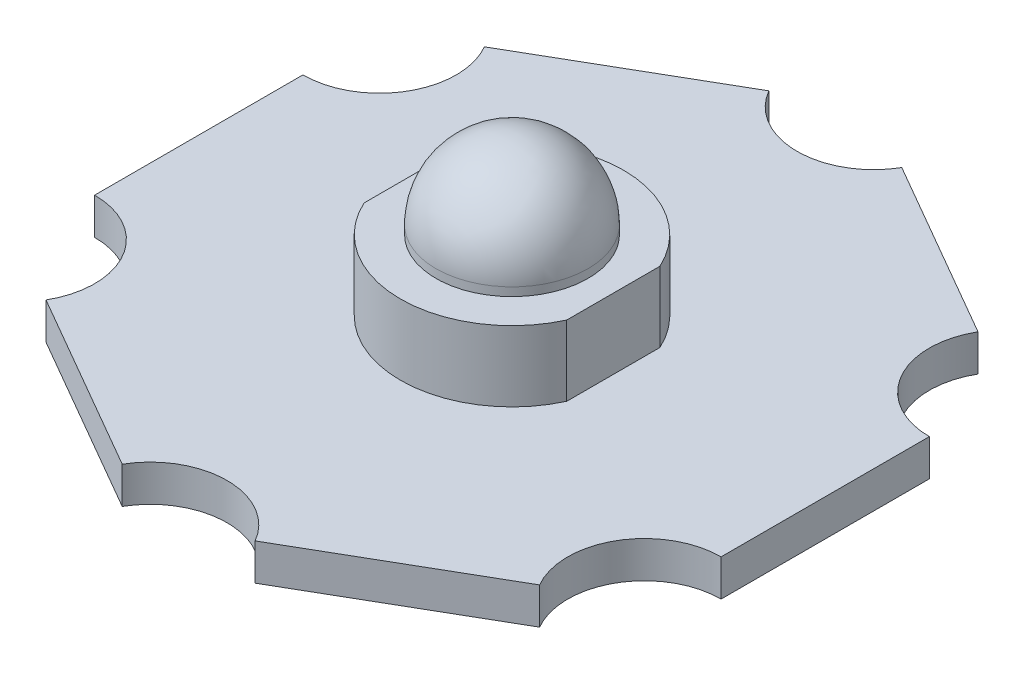
ISO-10303-21;
HEADER;
FILE_DESCRIPTION(('STEP AP214'),'2;1');
FILE_NAME('part.step','',(''),(''),'','','');
FILE_SCHEMA(('AUTOMOTIVE_DESIGN { 1 0 10303 214 1 1 1 1 }'));
ENDSEC;
DATA;
#1=APPLICATION_CONTEXT('core data for automotive mechanical design processes');
#2=APPLICATION_PROTOCOL_DEFINITION('international standard','automotive_design',2000,#1);
#3=PRODUCT_CONTEXT('',#1,'mechanical');
#4=PRODUCT('Part','Part','',(#3));
#5=PRODUCT_RELATED_PRODUCT_CATEGORY('part','',(#4));
#6=PRODUCT_DEFINITION_FORMATION('','',#4);
#7=PRODUCT_DEFINITION_CONTEXT('part definition',#1,'design');
#8=PRODUCT_DEFINITION('design','',#6,#7);
#9=PRODUCT_DEFINITION_SHAPE('','',#8);
#10=(LENGTH_UNIT() NAMED_UNIT(*) SI_UNIT(.MILLI.,.METRE.));
#11=(NAMED_UNIT(*) PLANE_ANGLE_UNIT() SI_UNIT($,.RADIAN.));
#12=(NAMED_UNIT(*) SI_UNIT($,.STERADIAN.) SOLID_ANGLE_UNIT());
#13=UNCERTAINTY_MEASURE_WITH_UNIT(LENGTH_MEASURE(1.E-05),#10,'distance_accuracy_value','');
#14=(GEOMETRIC_REPRESENTATION_CONTEXT(3) GLOBAL_UNCERTAINTY_ASSIGNED_CONTEXT((#13)) GLOBAL_UNIT_ASSIGNED_CONTEXT((#10,
#11,#12)) REPRESENTATION_CONTEXT('',''));
#15=CARTESIAN_POINT('',(0.,0.,0.));
#16=DIRECTION('',(0.,0.,1.));
#17=DIRECTION('',(1.,0.,0.));
#18=AXIS2_PLACEMENT_3D('',#15,#16,#17);
#19=CARTESIAN_POINT('',(0.,4.1656,0.));
#20=DIRECTION('',(0.,0.,1.));
#21=DIRECTION('',(0.,-1.,0.));
#22=AXIS2_PLACEMENT_3D('',#19,#20,#21);
#23=SPHERICAL_SURFACE('',#22,2.7432);
#24=CARTESIAN_POINT('',(0.,4.1656,0.));
#25=DIRECTION('',(0.,-1.,0.));
#26=DIRECTION('',(0.,0.,-1.));
#27=AXIS2_PLACEMENT_3D('',#24,#25,#26);
#28=CIRCLE('',#27,2.7432);
#29=CARTESIAN_POINT('',(0.,4.1656,-2.7432));
#30=VERTEX_POINT('',#29);
#31=CARTESIAN_POINT('',(0.,4.1656,2.7432));
#32=VERTEX_POINT('',#31);
#33=EDGE_CURVE('E143',#30,#32,#28,.T.);
#34=ORIENTED_EDGE('',*,*,#33,.F.);
#35=CARTESIAN_POINT('',(0.,4.1656,0.));
#36=DIRECTION('',(0.,-1.,0.));
#37=DIRECTION('',(0.,0.,-1.));
#38=AXIS2_PLACEMENT_3D('',#35,#36,#37);
#39=CIRCLE('',#38,2.7432);
#40=EDGE_CURVE('E145',#32,#30,#39,.T.);
#41=ORIENTED_EDGE('',*,*,#40,.F.);
#42=EDGE_LOOP('',(#34,#41));
#43=FACE_BOUND('',#42,.T.);
#44=ADVANCED_FACE('F17',(#43),#23,.T.);
#45=CARTESIAN_POINT('',(0.,6.9088,0.));
#46=DIRECTION('',(0.,-1.,0.));
#47=DIRECTION('',(0.,0.,-1.));
#48=AXIS2_PLACEMENT_3D('',#45,#46,#47);
#49=CYLINDRICAL_SURFACE('',#48,2.7432);
#50=CARTESIAN_POINT('',(0.,3.8608,0.));
#51=DIRECTION('',(0.,-1.,0.));
#52=DIRECTION('',(0.,0.,-1.));
#53=AXIS2_PLACEMENT_3D('',#50,#51,#52);
#54=CIRCLE('',#53,2.7432);
#55=CARTESIAN_POINT('',(0.,3.8608,-2.7432));
#56=VERTEX_POINT('',#55);
#57=EDGE_CURVE('E21',#56,#56,#54,.T.);
#58=ORIENTED_EDGE('',*,*,#57,.F.);
#59=EDGE_LOOP('',(#58));
#60=FACE_BOUND('',#59,.T.);
#61=ORIENTED_EDGE('',*,*,#33,.T.);
#62=ORIENTED_EDGE('',*,*,#40,.T.);
#63=EDGE_LOOP('',(#61,#62));
#64=FACE_BOUND('',#63,.T.);
#65=ADVANCED_FACE('F146',(#60,#64),#49,.T.);
#66=CARTESIAN_POINT('',(0.,3.8608,0.));
#67=DIRECTION('',(0.,1.,0.));
#68=DIRECTION('',(0.,0.,1.));
#69=AXIS2_PLACEMENT_3D('',#66,#67,#68);
#70=PLANE('',#69);
#71=CARTESIAN_POINT('',(0.,3.8608,0.));
#72=DIRECTION('',(0.,-1.,0.));
#73=DIRECTION('',(0.,0.,-1.));
#74=AXIS2_PLACEMENT_3D('',#71,#72,#73);
#75=CIRCLE('',#74,4.0259);
#76=CARTESIAN_POINT('',(3.6576,3.8608,1.68221076265729));
#77=VERTEX_POINT('',#76);
#78=CARTESIAN_POINT('',(-3.6576,3.8608,1.68221076265728));
#79=VERTEX_POINT('',#78);
#80=EDGE_CURVE('E207',#77,#79,#75,.T.);
#81=ORIENTED_EDGE('',*,*,#80,.F.);
#82=DIRECTION('',(0.,0.,1.));
#83=VECTOR('',#82,1.);
#84=CARTESIAN_POINT('',(3.6576,3.8608,-1.68221076265729));
#85=LINE('',#84,#83);
#86=CARTESIAN_POINT('',(3.6576,3.8608,-1.68221076265729));
#87=VERTEX_POINT('',#86);
#88=EDGE_CURVE('E210',#77,#87,#85,.F.);
#89=ORIENTED_EDGE('',*,*,#88,.T.);
#90=CARTESIAN_POINT('',(0.,3.8608,0.));
#91=DIRECTION('',(0.,-1.,0.));
#92=DIRECTION('',(0.,0.,-1.));
#93=AXIS2_PLACEMENT_3D('',#90,#91,#92);
#94=CIRCLE('',#93,4.0259);
#95=CARTESIAN_POINT('',(-3.6576,3.8608,-1.68221076265728));
#96=VERTEX_POINT('',#95);
#97=EDGE_CURVE('E130',#96,#87,#94,.T.);
#98=ORIENTED_EDGE('',*,*,#97,.F.);
#99=DIRECTION('',(0.,0.,-1.));
#100=VECTOR('',#99,1.);
#101=CARTESIAN_POINT('',(-3.6576,3.8608,-1.68221076265728));
#102=LINE('',#101,#100);
#103=EDGE_CURVE('E151',#96,#79,#102,.F.);
#104=ORIENTED_EDGE('',*,*,#103,.T.);
#105=EDGE_LOOP('',(#81,#89,#98,#104));
#106=FACE_BOUND('',#105,.T.);
#107=ORIENTED_EDGE('',*,*,#57,.T.);
#108=EDGE_LOOP('',(#107));
#109=FACE_BOUND('',#108,.T.);
#110=ADVANCED_FACE('F364',(#106,#109),#70,.T.);
#111=CARTESIAN_POINT('',(-3.6576,3.8608,-1.68221076265728));
#112=DIRECTION('',(1.,0.,0.));
#113=DIRECTION('',(0.,0.,-1.));
#114=AXIS2_PLACEMENT_3D('',#111,#112,#113);
#115=PLANE('',#114);
#116=DIRECTION('',(0.,-1.,0.));
#117=VECTOR('',#116,1.);
#118=CARTESIAN_POINT('',(-3.6576,3.8608,1.68221076265729));
#119=LINE('',#118,#117);
#120=CARTESIAN_POINT('',(-3.6576,1.3208,1.68221076265728));
#121=VERTEX_POINT('',#120);
#122=EDGE_CURVE('E208',#79,#121,#119,.T.);
#123=ORIENTED_EDGE('',*,*,#122,.F.);
#124=ORIENTED_EDGE('',*,*,#103,.F.);
#125=DIRECTION('',(0.,-1.,0.));
#126=VECTOR('',#125,1.);
#127=CARTESIAN_POINT('',(-3.6576,3.8608,-1.68221076265728));
#128=LINE('',#127,#126);
#129=CARTESIAN_POINT('',(-3.6576,1.3208,-1.68221076265728));
#130=VERTEX_POINT('',#129);
#131=EDGE_CURVE('E211',#130,#96,#128,.F.);
#132=ORIENTED_EDGE('',*,*,#131,.F.);
#133=DIRECTION('',(0.,0.,1.));
#134=VECTOR('',#133,1.);
#135=CARTESIAN_POINT('',(-3.6576,1.3208,0.));
#136=LINE('',#135,#134);
#137=EDGE_CURVE('E206',#121,#130,#136,.F.);
#138=ORIENTED_EDGE('',*,*,#137,.F.);
#139=EDGE_LOOP('',(#123,#124,#132,#138));
#140=FACE_BOUND('',#139,.T.);
#141=ADVANCED_FACE('F361',(#140),#115,.F.);
#142=CARTESIAN_POINT('',(0.,3.8608,0.));
#143=DIRECTION('',(0.,-1.,0.));
#144=DIRECTION('',(0.,0.,-1.));
#145=AXIS2_PLACEMENT_3D('',#142,#143,#144);
#146=CYLINDRICAL_SURFACE('',#145,4.0259);
#147=DIRECTION('',(0.,1.,0.));
#148=VECTOR('',#147,1.);
#149=CARTESIAN_POINT('',(3.6576,3.8608,-1.68221076265729));
#150=LINE('',#149,#148);
#151=CARTESIAN_POINT('',(3.6576,1.3208,-1.68221076265729));
#152=VERTEX_POINT('',#151);
#153=EDGE_CURVE('E212',#87,#152,#150,.F.);
#154=ORIENTED_EDGE('',*,*,#153,.T.);
#155=CARTESIAN_POINT('',(0.,1.3208,0.));
#156=DIRECTION('',(0.,-1.,0.));
#157=DIRECTION('',(0.,0.,-1.));
#158=AXIS2_PLACEMENT_3D('',#155,#156,#157);
#159=CIRCLE('',#158,4.0259);
#160=EDGE_CURVE('E204',#130,#152,#159,.T.);
#161=ORIENTED_EDGE('',*,*,#160,.F.);
#162=ORIENTED_EDGE('',*,*,#131,.T.);
#163=ORIENTED_EDGE('',*,*,#97,.T.);
#164=EDGE_LOOP('',(#154,#161,#162,#163));
#165=FACE_BOUND('',#164,.T.);
#166=ADVANCED_FACE('F357',(#165),#146,.T.);
#167=CARTESIAN_POINT('',(3.6576,3.8608,-1.68221076265729));
#168=DIRECTION('',(-1.,0.,0.));
#169=DIRECTION('',(0.,0.,1.));
#170=AXIS2_PLACEMENT_3D('',#167,#168,#169);
#171=PLANE('',#170);
#172=ORIENTED_EDGE('',*,*,#153,.F.);
#173=ORIENTED_EDGE('',*,*,#88,.F.);
#174=DIRECTION('',(0.,-1.,0.));
#175=VECTOR('',#174,1.);
#176=CARTESIAN_POINT('',(3.6576,3.8608,1.68221076265729));
#177=LINE('',#176,#175);
#178=CARTESIAN_POINT('',(3.6576,1.3208,1.68221076265729));
#179=VERTEX_POINT('',#178);
#180=EDGE_CURVE('E209',#179,#77,#177,.F.);
#181=ORIENTED_EDGE('',*,*,#180,.F.);
#182=DIRECTION('',(0.,0.,1.));
#183=VECTOR('',#182,1.);
#184=CARTESIAN_POINT('',(3.6576,1.3208,0.));
#185=LINE('',#184,#183);
#186=EDGE_CURVE('E203',#152,#179,#185,.T.);
#187=ORIENTED_EDGE('',*,*,#186,.F.);
#188=EDGE_LOOP('',(#172,#173,#181,#187));
#189=FACE_BOUND('',#188,.T.);
#190=ADVANCED_FACE('F353',(#189),#171,.F.);
#191=CARTESIAN_POINT('',(0.,3.8608,0.));
#192=DIRECTION('',(0.,-1.,0.));
#193=DIRECTION('',(0.,0.,-1.));
#194=AXIS2_PLACEMENT_3D('',#191,#192,#193);
#195=CYLINDRICAL_SURFACE('',#194,4.0259);
#196=ORIENTED_EDGE('',*,*,#80,.T.);
#197=ORIENTED_EDGE('',*,*,#122,.T.);
#198=CARTESIAN_POINT('',(0.,1.3208,0.));
#199=DIRECTION('',(0.,-1.,0.));
#200=DIRECTION('',(0.,0.,-1.));
#201=AXIS2_PLACEMENT_3D('',#198,#199,#200);
#202=CIRCLE('',#201,4.0259);
#203=EDGE_CURVE('E200',#179,#121,#202,.T.);
#204=ORIENTED_EDGE('',*,*,#203,.F.);
#205=ORIENTED_EDGE('',*,*,#180,.T.);
#206=EDGE_LOOP('',(#196,#197,#204,#205));
#207=FACE_BOUND('',#206,.T.);
#208=ADVANCED_FACE('F349',(#207),#195,.T.);
#209=CARTESIAN_POINT('',(0.,1.3208,0.));
#210=DIRECTION('',(0.,1.,0.));
#211=DIRECTION('',(0.,0.,1.));
#212=AXIS2_PLACEMENT_3D('',#209,#210,#211);
#213=PLANE('',#212);
#214=ORIENTED_EDGE('',*,*,#186,.T.);
#215=ORIENTED_EDGE('',*,*,#203,.T.);
#216=ORIENTED_EDGE('',*,*,#137,.T.);
#217=ORIENTED_EDGE('',*,*,#160,.T.);
#218=EDGE_LOOP('',(#214,#215,#216,#217));
#219=FACE_BOUND('',#218,.T.);
#220=CARTESIAN_POINT('',(0.,1.3208,13.0515801853007));
#221=DIRECTION('',(0.,1.,0.));
#222=DIRECTION('',(0.,0.,1.));
#223=AXIS2_PLACEMENT_3D('',#220,#221,#222);
#224=CIRCLE('',#223,2.7686);
#225=CARTESIAN_POINT('',(-2.3976779329176,1.3208,11.6672801853007));
#226=VERTEX_POINT('',#225);
#227=CARTESIAN_POINT('',(2.3976779329176,1.3208,11.6672801853007));
#228=VERTEX_POINT('',#227);
#229=EDGE_CURVE('E181',#226,#228,#224,.F.);
#230=ORIENTED_EDGE('',*,*,#229,.T.);
#231=DIRECTION('',(-0.866025403784439,0.,0.5));
#232=VECTOR('',#231,1.);
#233=CARTESIAN_POINT('',(0.,1.3208,13.0515801853007));
#234=LINE('',#233,#232);
#235=CARTESIAN_POINT('',(8.9053220670824,1.3208,7.91009009265034));
#236=VERTEX_POINT('',#235);
#237=EDGE_CURVE('E230',#228,#236,#234,.F.);
#238=ORIENTED_EDGE('',*,*,#237,.T.);
#239=CARTESIAN_POINT('',(11.303,1.3208,6.52579009265034));
#240=DIRECTION('',(0.,1.,0.));
#241=DIRECTION('',(0.,0.,1.));
#242=AXIS2_PLACEMENT_3D('',#239,#240,#241);
#243=CIRCLE('',#242,2.7686);
#244=CARTESIAN_POINT('',(11.303,1.3208,3.75719009265034));
#245=VERTEX_POINT('',#244);
#246=EDGE_CURVE('E177',#236,#245,#243,.F.);
#247=ORIENTED_EDGE('',*,*,#246,.T.);
#248=DIRECTION('',(0.,0.,1.));
#249=VECTOR('',#248,1.);
#250=CARTESIAN_POINT('',(11.303,1.3208,6.52579009265034));
#251=LINE('',#250,#249);
#252=CARTESIAN_POINT('',(11.303,1.3208,-3.75719009265033));
#253=VERTEX_POINT('',#252);
#254=EDGE_CURVE('E176',#245,#253,#251,.F.);
#255=ORIENTED_EDGE('',*,*,#254,.T.);
#256=CARTESIAN_POINT('',(11.303,1.3208,-6.52579009265034));
#257=DIRECTION('',(0.,1.,0.));
#258=DIRECTION('',(0.,0.,1.));
#259=AXIS2_PLACEMENT_3D('',#256,#257,#258);
#260=CIRCLE('',#259,2.7686);
#261=CARTESIAN_POINT('',(8.9053220670824,1.3208,-7.91009009265033));
#262=VERTEX_POINT('',#261);
#263=EDGE_CURVE('E197',#253,#262,#260,.F.);
#264=ORIENTED_EDGE('',*,*,#263,.T.);
#265=DIRECTION('',(0.866025403784439,0.,0.5));
#266=VECTOR('',#265,1.);
#267=CARTESIAN_POINT('',(11.303,1.3208,-6.52579009265034));
#268=LINE('',#267,#266);
#269=CARTESIAN_POINT('',(2.3976779329176,1.3208,-11.6672801853007));
#270=VERTEX_POINT('',#269);
#271=EDGE_CURVE('E221',#262,#270,#268,.F.);
#272=ORIENTED_EDGE('',*,*,#271,.T.);
#273=CARTESIAN_POINT('',(0.,1.3208,-13.0515801853007));
#274=DIRECTION('',(0.,1.,0.));
#275=DIRECTION('',(0.,0.,1.));
#276=AXIS2_PLACEMENT_3D('',#273,#274,#275);
#277=CIRCLE('',#276,2.7686);
#278=CARTESIAN_POINT('',(-2.3976779329176,1.3208,-11.6672801853007));
#279=VERTEX_POINT('',#278);
#280=EDGE_CURVE('E193',#270,#279,#277,.F.);
#281=ORIENTED_EDGE('',*,*,#280,.T.);
#282=DIRECTION('',(0.866025403784439,0.,-0.5));
#283=VECTOR('',#282,1.);
#284=CARTESIAN_POINT('',(0.,1.3208,-13.0515801853007));
#285=LINE('',#284,#283);
#286=CARTESIAN_POINT('',(-8.9053220670824,1.3208,-7.91009009265034));
#287=VERTEX_POINT('',#286);
#288=EDGE_CURVE('E224',#279,#287,#285,.F.);
#289=ORIENTED_EDGE('',*,*,#288,.T.);
#290=CARTESIAN_POINT('',(-11.303,1.3208,-6.52579009265034));
#291=DIRECTION('',(0.,1.,0.));
#292=DIRECTION('',(0.,0.,1.));
#293=AXIS2_PLACEMENT_3D('',#290,#291,#292);
#294=CIRCLE('',#293,2.7686);
#295=CARTESIAN_POINT('',(-11.303,1.3208,-3.75719009265034));
#296=VERTEX_POINT('',#295);
#297=EDGE_CURVE('E189',#287,#296,#294,.F.);
#298=ORIENTED_EDGE('',*,*,#297,.T.);
#299=DIRECTION('',(0.,0.,-1.));
#300=VECTOR('',#299,1.);
#301=CARTESIAN_POINT('',(-11.303,1.3208,-6.52579009265034));
#302=LINE('',#301,#300);
#303=CARTESIAN_POINT('',(-11.303,1.3208,3.75719009265034));
#304=VERTEX_POINT('',#303);
#305=EDGE_CURVE('E226',#296,#304,#302,.F.);
#306=ORIENTED_EDGE('',*,*,#305,.T.);
#307=CARTESIAN_POINT('',(-11.303,1.3208,6.52579009265034));
#308=DIRECTION('',(0.,1.,0.));
#309=DIRECTION('',(0.,0.,1.));
#310=AXIS2_PLACEMENT_3D('',#307,#308,#309);
#311=CIRCLE('',#310,2.7686);
#312=CARTESIAN_POINT('',(-8.9053220670824,1.3208,7.91009009265033));
#313=VERTEX_POINT('',#312);
#314=EDGE_CURVE('E185',#304,#313,#311,.F.);
#315=ORIENTED_EDGE('',*,*,#314,.T.);
#316=DIRECTION('',(-0.866025403784439,0.,-0.5));
#317=VECTOR('',#316,1.);
#318=CARTESIAN_POINT('',(-11.303,1.3208,6.52579009265034));
#319=LINE('',#318,#317);
#320=EDGE_CURVE('E228',#313,#226,#319,.F.);
#321=ORIENTED_EDGE('',*,*,#320,.T.);
#322=EDGE_LOOP('',(#230,#238,#247,#255,#264,#272,#281,#289,#298,#306,#315,#321));
#323=FACE_BOUND('',#322,.T.);
#324=ADVANCED_FACE('F314',(#219,#323),#213,.T.);
#325=CARTESIAN_POINT('',(11.303,-5.08,-6.52579009265034));
#326=DIRECTION('',(0.,1.,0.));
#327=DIRECTION('',(0.,0.,1.));
#328=AXIS2_PLACEMENT_3D('',#325,#326,#327);
#329=CYLINDRICAL_SURFACE('',#328,2.7686);
#330=DIRECTION('',(0.,1.,0.));
#331=VECTOR('',#330,1.);
#332=CARTESIAN_POINT('',(8.9053220670824,1.3208,-7.91009009265033));
#333=LINE('',#332,#331);
#334=CARTESIAN_POINT('',(8.9053220670824,0.,-7.91009009265033));
#335=VERTEX_POINT('',#334);
#336=EDGE_CURVE('E199',#335,#262,#333,.T.);
#337=ORIENTED_EDGE('',*,*,#336,.T.);
#338=ORIENTED_EDGE('',*,*,#263,.F.);
#339=DIRECTION('',(0.,1.,0.));
#340=VECTOR('',#339,1.);
#341=CARTESIAN_POINT('',(11.303,1.3208,-3.75719009265033));
#342=LINE('',#341,#340);
#343=CARTESIAN_POINT('',(11.303,0.,-3.75719009265033));
#344=VERTEX_POINT('',#343);
#345=EDGE_CURVE('E179',#253,#344,#342,.F.);
#346=ORIENTED_EDGE('',*,*,#345,.T.);
#347=CARTESIAN_POINT('',(11.303,0.,-6.52579009265034));
#348=DIRECTION('',(0.,1.,0.));
#349=DIRECTION('',(0.,0.,1.));
#350=AXIS2_PLACEMENT_3D('',#347,#348,#349);
#351=CIRCLE('',#350,2.7686);
#352=EDGE_CURVE('E173',#344,#335,#351,.F.);
#353=ORIENTED_EDGE('',*,*,#352,.T.);
#354=EDGE_LOOP('',(#337,#338,#346,#353));
#355=FACE_BOUND('',#354,.T.);
#356=ADVANCED_FACE('F308',(#355),#329,.F.);
#357=CARTESIAN_POINT('',(11.303,1.3208,-6.52579009265034));
#358=DIRECTION('',(-0.5,0.,0.866025403784439));
#359=DIRECTION('',(0.866025403784439,0.,0.5));
#360=AXIS2_PLACEMENT_3D('',#357,#358,#359);
#361=PLANE('',#360);
#362=ORIENTED_EDGE('',*,*,#336,.F.);
#363=DIRECTION('',(-0.866025403784438,0.,-0.5));
#364=VECTOR('',#363,1.);
#365=CARTESIAN_POINT('',(8.9053220670824,0.,-7.91009009265033));
#366=LINE('',#365,#364);
#367=CARTESIAN_POINT('',(2.3976779329176,0.,-11.6672801853007));
#368=VERTEX_POINT('',#367);
#369=EDGE_CURVE('E172',#335,#368,#366,.T.);
#370=ORIENTED_EDGE('',*,*,#369,.T.);
#371=DIRECTION('',(0.,1.,0.));
#372=VECTOR('',#371,1.);
#373=CARTESIAN_POINT('',(2.3976779329176,-5.08,-11.6672801853007));
#374=LINE('',#373,#372);
#375=EDGE_CURVE('E196',#368,#270,#374,.T.);
#376=ORIENTED_EDGE('',*,*,#375,.T.);
#377=ORIENTED_EDGE('',*,*,#271,.F.);
#378=EDGE_LOOP('',(#362,#370,#376,#377));
#379=FACE_BOUND('',#378,.T.);
#380=ADVANCED_FACE('F305',(#379),#361,.F.);
#381=CARTESIAN_POINT('',(0.,-5.08,-13.0515801853007));
#382=DIRECTION('',(0.,1.,0.));
#383=DIRECTION('',(0.,0.,1.));
#384=AXIS2_PLACEMENT_3D('',#381,#382,#383);
#385=CYLINDRICAL_SURFACE('',#384,2.7686);
#386=CARTESIAN_POINT('',(0.,0.,-13.0515801853007));
#387=DIRECTION('',(0.,1.,0.));
#388=DIRECTION('',(0.,0.,1.));
#389=AXIS2_PLACEMENT_3D('',#386,#387,#388);
#390=CIRCLE('',#389,2.7686);
#391=CARTESIAN_POINT('',(-2.3976779329176,0.,-11.6672801853007));
#392=VERTEX_POINT('',#391);
#393=EDGE_CURVE('E170',#368,#392,#390,.F.);
#394=ORIENTED_EDGE('',*,*,#393,.T.);
#395=DIRECTION('',(0.,1.,0.));
#396=VECTOR('',#395,1.);
#397=CARTESIAN_POINT('',(-2.3976779329176,1.3208,-11.6672801853007));
#398=LINE('',#397,#396);
#399=EDGE_CURVE('E195',#392,#279,#398,.T.);
#400=ORIENTED_EDGE('',*,*,#399,.T.);
#401=ORIENTED_EDGE('',*,*,#280,.F.);
#402=ORIENTED_EDGE('',*,*,#375,.F.);
#403=EDGE_LOOP('',(#394,#400,#401,#402));
#404=FACE_BOUND('',#403,.T.);
#405=ADVANCED_FACE('F340',(#404),#385,.F.);
#406=CARTESIAN_POINT('',(0.,1.3208,-13.0515801853007));
#407=DIRECTION('',(0.5,0.,0.866025403784439));
#408=DIRECTION('',(0.866025403784439,0.,-0.5));
#409=AXIS2_PLACEMENT_3D('',#406,#407,#408);
#410=PLANE('',#409);
#411=ORIENTED_EDGE('',*,*,#399,.F.);
#412=DIRECTION('',(-0.866025403784439,0.,0.5));
#413=VECTOR('',#412,1.);
#414=CARTESIAN_POINT('',(-2.3976779329176,0.,-11.6672801853007));
#415=LINE('',#414,#413);
#416=CARTESIAN_POINT('',(-8.9053220670824,0.,-7.91009009265034));
#417=VERTEX_POINT('',#416);
#418=EDGE_CURVE('E169',#392,#417,#415,.T.);
#419=ORIENTED_EDGE('',*,*,#418,.T.);
#420=DIRECTION('',(0.,1.,0.));
#421=VECTOR('',#420,1.);
#422=CARTESIAN_POINT('',(-8.9053220670824,-5.08,-7.91009009265034));
#423=LINE('',#422,#421);
#424=EDGE_CURVE('E192',#417,#287,#423,.T.);
#425=ORIENTED_EDGE('',*,*,#424,.T.);
#426=ORIENTED_EDGE('',*,*,#288,.F.);
#427=EDGE_LOOP('',(#411,#419,#425,#426));
#428=FACE_BOUND('',#427,.T.);
#429=ADVANCED_FACE('F300',(#428),#410,.F.);
#430=CARTESIAN_POINT('',(-11.303,-5.08,-6.52579009265034));
#431=DIRECTION('',(0.,1.,0.));
#432=DIRECTION('',(0.,0.,1.));
#433=AXIS2_PLACEMENT_3D('',#430,#431,#432);
#434=CYLINDRICAL_SURFACE('',#433,2.7686);
#435=DIRECTION('',(0.,1.,0.));
#436=VECTOR('',#435,1.);
#437=CARTESIAN_POINT('',(-11.303,1.3208,-3.75719009265034));
#438=LINE('',#437,#436);
#439=CARTESIAN_POINT('',(-11.303,0.,-3.75719009265034));
#440=VERTEX_POINT('',#439);
#441=EDGE_CURVE('E191',#440,#296,#438,.T.);
#442=ORIENTED_EDGE('',*,*,#441,.T.);
#443=ORIENTED_EDGE('',*,*,#297,.F.);
#444=ORIENTED_EDGE('',*,*,#424,.F.);
#445=CARTESIAN_POINT('',(-11.303,0.,-6.52579009265034));
#446=DIRECTION('',(0.,1.,0.));
#447=DIRECTION('',(0.,0.,1.));
#448=AXIS2_PLACEMENT_3D('',#445,#446,#447);
#449=CIRCLE('',#448,2.7686);
#450=EDGE_CURVE('E166',#417,#440,#449,.F.);
#451=ORIENTED_EDGE('',*,*,#450,.T.);
#452=EDGE_LOOP('',(#442,#443,#444,#451));
#453=FACE_BOUND('',#452,.T.);
#454=ADVANCED_FACE('F295',(#453),#434,.F.);
#455=CARTESIAN_POINT('',(-11.303,1.3208,-6.52579009265034));
#456=DIRECTION('',(1.,0.,0.));
#457=DIRECTION('',(0.,0.,-1.));
#458=AXIS2_PLACEMENT_3D('',#455,#456,#457);
#459=PLANE('',#458);
#460=ORIENTED_EDGE('',*,*,#441,.F.);
#461=DIRECTION('',(0.,0.,1.));
#462=VECTOR('',#461,1.);
#463=CARTESIAN_POINT('',(-11.303,0.,0.));
#464=LINE('',#463,#462);
#465=CARTESIAN_POINT('',(-11.303,0.,3.75719009265034));
#466=VERTEX_POINT('',#465);
#467=EDGE_CURVE('E165',#440,#466,#464,.T.);
#468=ORIENTED_EDGE('',*,*,#467,.T.);
#469=DIRECTION('',(0.,1.,0.));
#470=VECTOR('',#469,1.);
#471=CARTESIAN_POINT('',(-11.303,-5.08,3.75719009265034));
#472=LINE('',#471,#470);
#473=EDGE_CURVE('E188',#466,#304,#472,.T.);
#474=ORIENTED_EDGE('',*,*,#473,.T.);
#475=ORIENTED_EDGE('',*,*,#305,.F.);
#476=EDGE_LOOP('',(#460,#468,#474,#475));
#477=FACE_BOUND('',#476,.T.);
#478=ADVANCED_FACE('F291',(#477),#459,.F.);
#479=CARTESIAN_POINT('',(-11.303,-5.08,6.52579009265034));
#480=DIRECTION('',(0.,1.,0.));
#481=DIRECTION('',(0.,0.,1.));
#482=AXIS2_PLACEMENT_3D('',#479,#480,#481);
#483=CYLINDRICAL_SURFACE('',#482,2.7686);
#484=DIRECTION('',(0.,1.,0.));
#485=VECTOR('',#484,1.);
#486=CARTESIAN_POINT('',(-8.9053220670824,1.3208,7.91009009265033));
#487=LINE('',#486,#485);
#488=CARTESIAN_POINT('',(-8.9053220670824,0.,7.91009009265033));
#489=VERTEX_POINT('',#488);
#490=EDGE_CURVE('E187',#489,#313,#487,.T.);
#491=ORIENTED_EDGE('',*,*,#490,.T.);
#492=ORIENTED_EDGE('',*,*,#314,.F.);
#493=ORIENTED_EDGE('',*,*,#473,.F.);
#494=CARTESIAN_POINT('',(-11.303,0.,6.52579009265034));
#495=DIRECTION('',(0.,1.,0.));
#496=DIRECTION('',(0.,0.,1.));
#497=AXIS2_PLACEMENT_3D('',#494,#495,#496);
#498=CIRCLE('',#497,2.7686);
#499=EDGE_CURVE('E162',#466,#489,#498,.F.);
#500=ORIENTED_EDGE('',*,*,#499,.T.);
#501=EDGE_LOOP('',(#491,#492,#493,#500));
#502=FACE_BOUND('',#501,.T.);
#503=ADVANCED_FACE('F287',(#502),#483,.F.);
#504=CARTESIAN_POINT('',(-11.303,1.3208,6.52579009265034));
#505=DIRECTION('',(0.5,0.,-0.866025403784439));
#506=DIRECTION('',(-0.866025403784439,0.,-0.5));
#507=AXIS2_PLACEMENT_3D('',#504,#505,#506);
#508=PLANE('',#507);
#509=ORIENTED_EDGE('',*,*,#490,.F.);
#510=DIRECTION('',(0.866025403784438,0.,0.5));
#511=VECTOR('',#510,1.);
#512=CARTESIAN_POINT('',(-8.9053220670824,0.,7.91009009265033));
#513=LINE('',#512,#511);
#514=CARTESIAN_POINT('',(-2.3976779329176,0.,11.6672801853007));
#515=VERTEX_POINT('',#514);
#516=EDGE_CURVE('E161',#489,#515,#513,.T.);
#517=ORIENTED_EDGE('',*,*,#516,.T.);
#518=DIRECTION('',(0.,1.,0.));
#519=VECTOR('',#518,1.);
#520=CARTESIAN_POINT('',(-2.3976779329176,-5.08,11.6672801853007));
#521=LINE('',#520,#519);
#522=EDGE_CURVE('E184',#515,#226,#521,.T.);
#523=ORIENTED_EDGE('',*,*,#522,.T.);
#524=ORIENTED_EDGE('',*,*,#320,.F.);
#525=EDGE_LOOP('',(#509,#517,#523,#524));
#526=FACE_BOUND('',#525,.T.);
#527=ADVANCED_FACE('F283',(#526),#508,.F.);
#528=CARTESIAN_POINT('',(0.,-5.08,13.0515801853007));
#529=DIRECTION('',(0.,1.,0.));
#530=DIRECTION('',(0.,0.,1.));
#531=AXIS2_PLACEMENT_3D('',#528,#529,#530);
#532=CYLINDRICAL_SURFACE('',#531,2.7686);
#533=ORIENTED_EDGE('',*,*,#522,.F.);
#534=CARTESIAN_POINT('',(0.,0.,13.0515801853007));
#535=DIRECTION('',(0.,1.,0.));
#536=DIRECTION('',(0.,0.,1.));
#537=AXIS2_PLACEMENT_3D('',#534,#535,#536);
#538=CIRCLE('',#537,2.7686);
#539=CARTESIAN_POINT('',(2.3976779329176,0.,11.6672801853007));
#540=VERTEX_POINT('',#539);
#541=EDGE_CURVE('E158',#515,#540,#538,.F.);
#542=ORIENTED_EDGE('',*,*,#541,.T.);
#543=DIRECTION('',(0.,1.,0.));
#544=VECTOR('',#543,1.);
#545=CARTESIAN_POINT('',(2.3976779329176,1.3208,11.6672801853007));
#546=LINE('',#545,#544);
#547=EDGE_CURVE('E183',#540,#228,#546,.T.);
#548=ORIENTED_EDGE('',*,*,#547,.T.);
#549=ORIENTED_EDGE('',*,*,#229,.F.);
#550=EDGE_LOOP('',(#533,#542,#548,#549));
#551=FACE_BOUND('',#550,.T.);
#552=ADVANCED_FACE('F279',(#551),#532,.F.);
#553=CARTESIAN_POINT('',(0.,1.3208,13.0515801853007));
#554=DIRECTION('',(-0.5,0.,-0.866025403784439));
#555=DIRECTION('',(-0.866025403784439,0.,0.5));
#556=AXIS2_PLACEMENT_3D('',#553,#554,#555);
#557=PLANE('',#556);
#558=DIRECTION('',(0.,1.,0.));
#559=VECTOR('',#558,1.);
#560=CARTESIAN_POINT('',(8.9053220670824,-5.08,7.91009009265034));
#561=LINE('',#560,#559);
#562=CARTESIAN_POINT('',(8.9053220670824,0.,7.91009009265034));
#563=VERTEX_POINT('',#562);
#564=EDGE_CURVE('E180',#563,#236,#561,.T.);
#565=ORIENTED_EDGE('',*,*,#564,.T.);
#566=ORIENTED_EDGE('',*,*,#237,.F.);
#567=ORIENTED_EDGE('',*,*,#547,.F.);
#568=DIRECTION('',(0.866025403784439,0.,-0.5));
#569=VECTOR('',#568,1.);
#570=CARTESIAN_POINT('',(2.3976779329176,0.,11.6672801853007));
#571=LINE('',#570,#569);
#572=EDGE_CURVE('E157',#540,#563,#571,.T.);
#573=ORIENTED_EDGE('',*,*,#572,.T.);
#574=EDGE_LOOP('',(#565,#566,#567,#573));
#575=FACE_BOUND('',#574,.T.);
#576=ADVANCED_FACE('F271',(#575),#557,.F.);
#577=CARTESIAN_POINT('',(11.303,-5.08,6.52579009265034));
#578=DIRECTION('',(0.,1.,0.));
#579=DIRECTION('',(0.,0.,1.));
#580=AXIS2_PLACEMENT_3D('',#577,#578,#579);
#581=CYLINDRICAL_SURFACE('',#580,2.7686);
#582=DIRECTION('',(0.,1.,0.));
#583=VECTOR('',#582,1.);
#584=CARTESIAN_POINT('',(11.303,1.3208,3.75719009265034));
#585=LINE('',#584,#583);
#586=CARTESIAN_POINT('',(11.303,0.,3.75719009265034));
#587=VERTEX_POINT('',#586);
#588=EDGE_CURVE('E35',#587,#245,#585,.T.);
#589=ORIENTED_EDGE('',*,*,#588,.T.);
#590=ORIENTED_EDGE('',*,*,#246,.F.);
#591=ORIENTED_EDGE('',*,*,#564,.F.);
#592=CARTESIAN_POINT('',(11.303,0.,6.52579009265034));
#593=DIRECTION('',(0.,1.,0.));
#594=DIRECTION('',(0.,0.,1.));
#595=AXIS2_PLACEMENT_3D('',#592,#593,#594);
#596=CIRCLE('',#595,2.7686);
#597=EDGE_CURVE('E27',#563,#587,#596,.F.);
#598=ORIENTED_EDGE('',*,*,#597,.T.);
#599=EDGE_LOOP('',(#589,#590,#591,#598));
#600=FACE_BOUND('',#599,.T.);
#601=ADVANCED_FACE('F311',(#600),#581,.F.);
#602=CARTESIAN_POINT('',(11.303,1.3208,6.52579009265034));
#603=DIRECTION('',(-1.,0.,0.));
#604=DIRECTION('',(0.,0.,1.));
#605=AXIS2_PLACEMENT_3D('',#602,#603,#604);
#606=PLANE('',#605);
#607=ORIENTED_EDGE('',*,*,#588,.F.);
#608=DIRECTION('',(0.,0.,1.));
#609=VECTOR('',#608,1.);
#610=CARTESIAN_POINT('',(11.303,0.,0.));
#611=LINE('',#610,#609);
#612=EDGE_CURVE('E10',#587,#344,#611,.F.);
#613=ORIENTED_EDGE('',*,*,#612,.T.);
#614=ORIENTED_EDGE('',*,*,#345,.F.);
#615=ORIENTED_EDGE('',*,*,#254,.F.);
#616=EDGE_LOOP('',(#607,#613,#614,#615));
#617=FACE_BOUND('',#616,.T.);
#618=ADVANCED_FACE('F315',(#617),#606,.F.);
#619=CARTESIAN_POINT('',(0.,0.,0.));
#620=DIRECTION('',(0.,1.,0.));
#621=DIRECTION('',(0.,0.,1.));
#622=AXIS2_PLACEMENT_3D('',#619,#620,#621);
#623=PLANE('',#622);
#624=ORIENTED_EDGE('',*,*,#597,.F.);
#625=ORIENTED_EDGE('',*,*,#572,.F.);
#626=ORIENTED_EDGE('',*,*,#541,.F.);
#627=ORIENTED_EDGE('',*,*,#516,.F.);
#628=ORIENTED_EDGE('',*,*,#499,.F.);
#629=ORIENTED_EDGE('',*,*,#467,.F.);
#630=ORIENTED_EDGE('',*,*,#450,.F.);
#631=ORIENTED_EDGE('',*,*,#418,.F.);
#632=ORIENTED_EDGE('',*,*,#393,.F.);
#633=ORIENTED_EDGE('',*,*,#369,.F.);
#634=ORIENTED_EDGE('',*,*,#352,.F.);
#635=ORIENTED_EDGE('',*,*,#612,.F.);
#636=EDGE_LOOP('',(#624,#625,#626,#627,#628,#629,#630,#631,#632,#633,#634,#635));
#637=FACE_BOUND('',#636,.T.);
#638=ADVANCED_FACE('F276',(#637),#623,.F.);
#639=CLOSED_SHELL('',(#44,#65,#110,#141,#166,#190,#208,#324,#356,#380,#405,#429,#454,#478,#503,
#527,#552,#576,#601,#618,#638));
#640=MANIFOLD_SOLID_BREP('B1',#639);
#641=ADVANCED_BREP_SHAPE_REPRESENTATION('',(#18,#640),#14);
#642=SHAPE_DEFINITION_REPRESENTATION(#9,#641);
ENDSEC;
END-ISO-10303-21;
